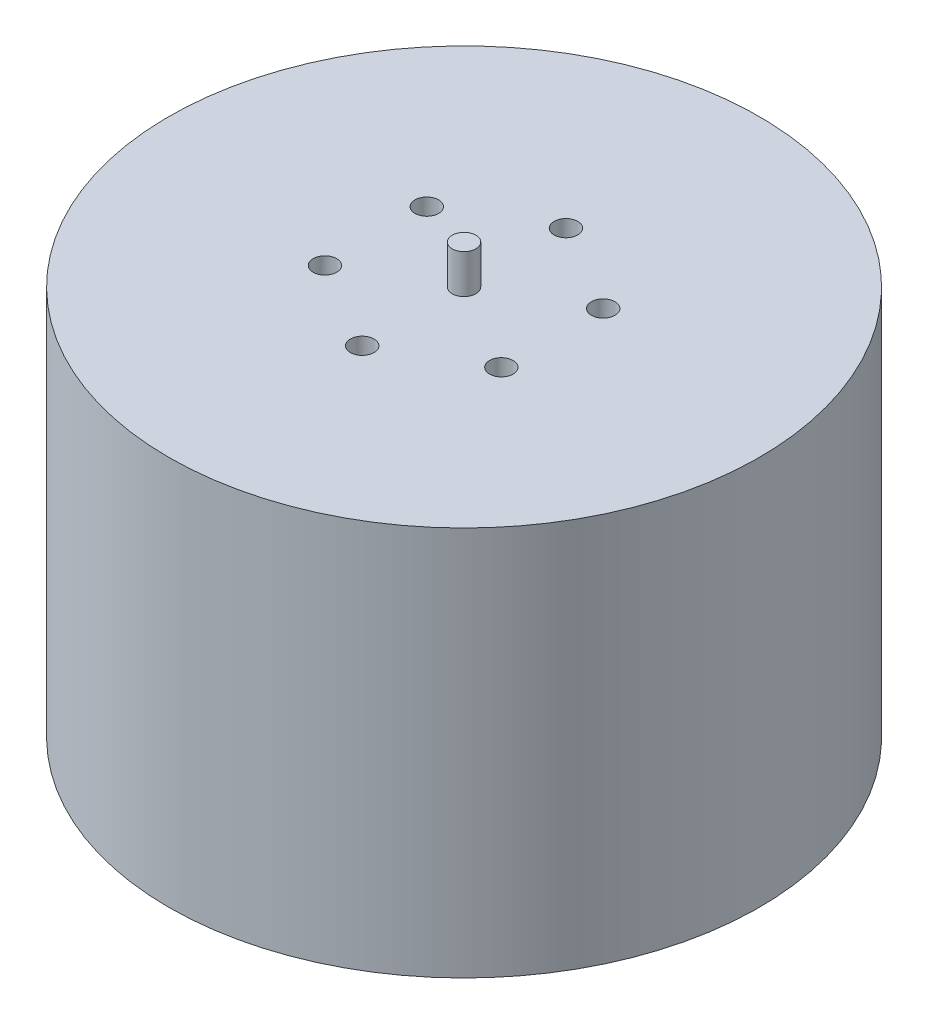
ISO-10303-21;
HEADER;
FILE_DESCRIPTION(('STEP AP214'),'2;1');
FILE_NAME('part.step','',(''),(''),'','','');
FILE_SCHEMA(('AUTOMOTIVE_DESIGN { 1 0 10303 214 1 1 1 1 }'));
ENDSEC;
DATA;
#1=APPLICATION_CONTEXT('core data for automotive mechanical design processes');
#2=APPLICATION_PROTOCOL_DEFINITION('international standard','automotive_design',2000,#1);
#3=PRODUCT_CONTEXT('',#1,'mechanical');
#4=PRODUCT('Part','Part','',(#3));
#5=PRODUCT_RELATED_PRODUCT_CATEGORY('part','',(#4));
#6=PRODUCT_DEFINITION_FORMATION('','',#4);
#7=PRODUCT_DEFINITION_CONTEXT('part definition',#1,'design');
#8=PRODUCT_DEFINITION('design','',#6,#7);
#9=PRODUCT_DEFINITION_SHAPE('','',#8);
#10=(LENGTH_UNIT() NAMED_UNIT(*) SI_UNIT(.MILLI.,.METRE.));
#11=(NAMED_UNIT(*) PLANE_ANGLE_UNIT() SI_UNIT($,.RADIAN.));
#12=(NAMED_UNIT(*) SI_UNIT($,.STERADIAN.) SOLID_ANGLE_UNIT());
#13=UNCERTAINTY_MEASURE_WITH_UNIT(LENGTH_MEASURE(1.E-05),#10,'distance_accuracy_value','');
#14=(GEOMETRIC_REPRESENTATION_CONTEXT(3) GLOBAL_UNCERTAINTY_ASSIGNED_CONTEXT((#13)) GLOBAL_UNIT_ASSIGNED_CONTEXT((#10,
#11,#12)) REPRESENTATION_CONTEXT('',''));
#15=CARTESIAN_POINT('',(0.,0.,0.));
#16=DIRECTION('',(0.,0.,1.));
#17=DIRECTION('',(1.,0.,0.));
#18=AXIS2_PLACEMENT_3D('',#15,#16,#17);
#19=CARTESIAN_POINT('',(0.,66.,0.));
#20=DIRECTION('',(0.,-1.,0.));
#21=DIRECTION('',(0.,0.,-1.));
#22=AXIS2_PLACEMENT_3D('',#19,#20,#21);
#23=CYLINDRICAL_SURFACE('',#22,50.);
#24=CARTESIAN_POINT('',(0.,66.,0.));
#25=DIRECTION('',(0.,1.,0.));
#26=DIRECTION('',(0.,0.,1.));
#27=AXIS2_PLACEMENT_3D('',#24,#25,#26);
#28=CIRCLE('',#27,50.);
#29=CARTESIAN_POINT('',(0.,66.,50.));
#30=VERTEX_POINT('',#29);
#31=EDGE_CURVE('E10',#30,#30,#28,.T.);
#32=ORIENTED_EDGE('',*,*,#31,.F.);
#33=EDGE_LOOP('',(#32));
#34=FACE_BOUND('',#33,.T.);
#35=CARTESIAN_POINT('',(0.,0.,0.));
#36=DIRECTION('',(0.,1.,0.));
#37=DIRECTION('',(0.,0.,1.));
#38=AXIS2_PLACEMENT_3D('',#35,#36,#37);
#39=CIRCLE('',#38,50.);
#40=CARTESIAN_POINT('',(0.,0.,50.));
#41=VERTEX_POINT('',#40);
#42=EDGE_CURVE('E38',#41,#41,#39,.T.);
#43=ORIENTED_EDGE('',*,*,#42,.T.);
#44=EDGE_LOOP('',(#43));
#45=FACE_BOUND('',#44,.T.);
#46=ADVANCED_FACE('F35',(#34,#45),#23,.T.);
#47=CARTESIAN_POINT('',(0.,66.,0.));
#48=DIRECTION('',(0.,1.,0.));
#49=DIRECTION('',(0.,0.,1.));
#50=AXIS2_PLACEMENT_3D('',#47,#48,#49);
#51=PLANE('',#50);
#52=CARTESIAN_POINT('',(0.,66.,0.));
#53=DIRECTION('',(0.,1.,0.));
#54=DIRECTION('',(0.,0.,1.));
#55=AXIS2_PLACEMENT_3D('',#52,#53,#54);
#56=CIRCLE('',#55,2.);
#57=CARTESIAN_POINT('',(0.,66.,2.));
#58=VERTEX_POINT('',#57);
#59=EDGE_CURVE('E83',#58,#58,#56,.T.);
#60=ORIENTED_EDGE('',*,*,#59,.F.);
#61=EDGE_LOOP('',(#60));
#62=FACE_BOUND('',#61,.T.);
#63=CARTESIAN_POINT('',(0.,66.,-17.25));
#64=DIRECTION('',(0.,1.,0.));
#65=DIRECTION('',(0.,0.,1.));
#66=AXIS2_PLACEMENT_3D('',#63,#64,#65);
#67=CIRCLE('',#66,2.);
#68=CARTESIAN_POINT('',(0.,66.,-15.25));
#69=VERTEX_POINT('',#68);
#70=EDGE_CURVE('E68',#69,#69,#67,.T.);
#71=ORIENTED_EDGE('',*,*,#70,.F.);
#72=EDGE_LOOP('',(#71));
#73=FACE_BOUND('',#72,.T.);
#74=CARTESIAN_POINT('',(-14.9389382152816,66.,8.62499999999986));
#75=DIRECTION('',(0.,1.,0.));
#76=DIRECTION('',(0.,0.,1.));
#77=AXIS2_PLACEMENT_3D('',#74,#75,#76);
#78=CIRCLE('',#77,2.);
#79=CARTESIAN_POINT('',(-14.9389382152816,66.,10.6249999999999));
#80=VERTEX_POINT('',#79);
#81=EDGE_CURVE('E57',#80,#80,#78,.T.);
#82=ORIENTED_EDGE('',*,*,#81,.F.);
#83=EDGE_LOOP('',(#82));
#84=FACE_BOUND('',#83,.T.);
#85=CARTESIAN_POINT('',(-1.20456106190088E-13,66.,17.25));
#86=DIRECTION('',(0.,1.,0.));
#87=DIRECTION('',(0.,0.,1.));
#88=AXIS2_PLACEMENT_3D('',#85,#86,#87);
#89=CIRCLE('',#88,2.);
#90=CARTESIAN_POINT('',(-1.20456106190088E-13,66.,19.25));
#91=VERTEX_POINT('',#90);
#92=EDGE_CURVE('E56',#91,#91,#89,.T.);
#93=ORIENTED_EDGE('',*,*,#92,.F.);
#94=EDGE_LOOP('',(#93));
#95=FACE_BOUND('',#94,.T.);
#96=CARTESIAN_POINT('',(14.9389382152815,66.,8.62500000000007));
#97=DIRECTION('',(0.,1.,0.));
#98=DIRECTION('',(0.,0.,1.));
#99=AXIS2_PLACEMENT_3D('',#96,#97,#98);
#100=CIRCLE('',#99,2.);
#101=CARTESIAN_POINT('',(14.9389382152815,66.,10.6250000000001));
#102=VERTEX_POINT('',#101);
#103=EDGE_CURVE('E50',#102,#102,#100,.T.);
#104=ORIENTED_EDGE('',*,*,#103,.F.);
#105=EDGE_LOOP('',(#104));
#106=FACE_BOUND('',#105,.T.);
#107=CARTESIAN_POINT('',(-14.9389382152815,66.,-8.62500000000018));
#108=DIRECTION('',(0.,1.,0.));
#109=DIRECTION('',(0.,0.,1.));
#110=AXIS2_PLACEMENT_3D('',#107,#108,#109);
#111=CIRCLE('',#110,2.);
#112=CARTESIAN_POINT('',(-14.9389382152815,66.,-6.62500000000017));
#113=VERTEX_POINT('',#112);
#114=EDGE_CURVE('E69',#113,#113,#111,.T.);
#115=ORIENTED_EDGE('',*,*,#114,.F.);
#116=EDGE_LOOP('',(#115));
#117=FACE_BOUND('',#116,.T.);
#118=CARTESIAN_POINT('',(14.9389382152816,66.,-8.62499999999997));
#119=DIRECTION('',(0.,1.,0.));
#120=DIRECTION('',(0.,0.,1.));
#121=AXIS2_PLACEMENT_3D('',#118,#119,#120);
#122=CIRCLE('',#121,2.);
#123=CARTESIAN_POINT('',(14.9389382152816,66.,-6.62499999999996));
#124=VERTEX_POINT('',#123);
#125=EDGE_CURVE('E47',#124,#124,#122,.T.);
#126=ORIENTED_EDGE('',*,*,#125,.F.);
#127=EDGE_LOOP('',(#126));
#128=FACE_BOUND('',#127,.T.);
#129=ORIENTED_EDGE('',*,*,#31,.T.);
#130=EDGE_LOOP('',(#129));
#131=FACE_BOUND('',#130,.T.);
#132=ADVANCED_FACE('F132',(#62,#73,#84,#95,#106,#117,#128,#131),#51,.T.);
#133=CARTESIAN_POINT('',(0.,0.,0.));
#134=DIRECTION('',(0.,1.,0.));
#135=DIRECTION('',(0.,0.,1.));
#136=AXIS2_PLACEMENT_3D('',#133,#134,#135);
#137=PLANE('',#136);
#138=CARTESIAN_POINT('',(0.,0.,-32.2228944585277));
#139=DIRECTION('',(0.,-1.,0.));
#140=DIRECTION('',(0.,0.,-1.));
#141=AXIS2_PLACEMENT_3D('',#138,#139,#140);
#142=CIRCLE('',#141,2.);
#143=CARTESIAN_POINT('',(0.,0.,-34.2228944585277));
#144=VERTEX_POINT('',#143);
#145=EDGE_CURVE('E113',#144,#144,#142,.T.);
#146=ORIENTED_EDGE('',*,*,#145,.F.);
#147=EDGE_LOOP('',(#146));
#148=FACE_BOUND('',#147,.T.);
#149=CARTESIAN_POINT('',(-32.2228944585277,0.,1.12505634685461E-13));
#150=DIRECTION('',(0.,-1.,0.));
#151=DIRECTION('',(0.,0.,-1.));
#152=AXIS2_PLACEMENT_3D('',#149,#150,#151);
#153=CIRCLE('',#152,2.);
#154=CARTESIAN_POINT('',(-32.2228944585277,0.,-1.99999999999989));
#155=VERTEX_POINT('',#154);
#156=EDGE_CURVE('E110',#155,#155,#153,.T.);
#157=ORIENTED_EDGE('',*,*,#156,.F.);
#158=EDGE_LOOP('',(#157));
#159=FACE_BOUND('',#158,.T.);
#160=CARTESIAN_POINT('',(2.25011269370922E-13,0.,32.2228944585277));
#161=DIRECTION('',(0.,-1.,0.));
#162=DIRECTION('',(0.,0.,-1.));
#163=AXIS2_PLACEMENT_3D('',#160,#161,#162);
#164=CIRCLE('',#163,2.);
#165=CARTESIAN_POINT('',(2.25011269370922E-13,0.,30.2228944585277));
#166=VERTEX_POINT('',#165);
#167=EDGE_CURVE('E104',#166,#166,#164,.T.);
#168=ORIENTED_EDGE('',*,*,#167,.F.);
#169=EDGE_LOOP('',(#168));
#170=FACE_BOUND('',#169,.T.);
#171=CARTESIAN_POINT('',(32.2228944585277,0.,-3.37516904056383E-13));
#172=DIRECTION('',(0.,-1.,0.));
#173=DIRECTION('',(0.,0.,-1.));
#174=AXIS2_PLACEMENT_3D('',#171,#172,#173);
#175=CIRCLE('',#174,2.);
#176=CARTESIAN_POINT('',(32.2228944585277,0.,-2.00000000000034));
#177=VERTEX_POINT('',#176);
#178=EDGE_CURVE('E98',#177,#177,#175,.T.);
#179=ORIENTED_EDGE('',*,*,#178,.F.);
#180=EDGE_LOOP('',(#179));
#181=FACE_BOUND('',#180,.T.);
#182=CARTESIAN_POINT('',(0.,0.,0.));
#183=DIRECTION('',(0.,-1.,0.));
#184=DIRECTION('',(0.,0.,-1.));
#185=AXIS2_PLACEMENT_3D('',#182,#183,#184);
#186=CIRCLE('',#185,3.);
#187=CARTESIAN_POINT('',(0.,0.,-3.));
#188=VERTEX_POINT('',#187);
#189=EDGE_CURVE('E89',#188,#188,#186,.T.);
#190=ORIENTED_EDGE('',*,*,#189,.F.);
#191=EDGE_LOOP('',(#190));
#192=FACE_BOUND('',#191,.T.);
#193=CARTESIAN_POINT('',(0.,0.,-17.25));
#194=DIRECTION('',(0.,1.,0.));
#195=DIRECTION('',(0.,0.,1.));
#196=AXIS2_PLACEMENT_3D('',#193,#194,#195);
#197=CIRCLE('',#196,2.);
#198=CARTESIAN_POINT('',(0.,0.,-15.25));
#199=VERTEX_POINT('',#198);
#200=EDGE_CURVE('E65',#199,#199,#197,.T.);
#201=ORIENTED_EDGE('',*,*,#200,.T.);
#202=EDGE_LOOP('',(#201));
#203=FACE_BOUND('',#202,.T.);
#204=CARTESIAN_POINT('',(-14.9389382152816,0.,8.62499999999986));
#205=DIRECTION('',(0.,1.,0.));
#206=DIRECTION('',(0.,0.,1.));
#207=AXIS2_PLACEMENT_3D('',#204,#205,#206);
#208=CIRCLE('',#207,2.);
#209=CARTESIAN_POINT('',(-14.9389382152816,0.,10.6249999999999));
#210=VERTEX_POINT('',#209);
#211=EDGE_CURVE('E72',#210,#210,#208,.T.);
#212=ORIENTED_EDGE('',*,*,#211,.T.);
#213=EDGE_LOOP('',(#212));
#214=FACE_BOUND('',#213,.T.);
#215=CARTESIAN_POINT('',(-1.20456106190088E-13,0.,17.25));
#216=DIRECTION('',(0.,1.,0.));
#217=DIRECTION('',(0.,0.,1.));
#218=AXIS2_PLACEMENT_3D('',#215,#216,#217);
#219=CIRCLE('',#218,2.);
#220=CARTESIAN_POINT('',(-1.20456106190088E-13,0.,19.25));
#221=VERTEX_POINT('',#220);
#222=EDGE_CURVE('E53',#221,#221,#219,.T.);
#223=ORIENTED_EDGE('',*,*,#222,.T.);
#224=EDGE_LOOP('',(#223));
#225=FACE_BOUND('',#224,.T.);
#226=CARTESIAN_POINT('',(14.9389382152815,0.,8.62500000000007));
#227=DIRECTION('',(0.,1.,0.));
#228=DIRECTION('',(0.,0.,1.));
#229=AXIS2_PLACEMENT_3D('',#226,#227,#228);
#230=CIRCLE('',#229,2.);
#231=CARTESIAN_POINT('',(14.9389382152815,0.,10.6250000000001));
#232=VERTEX_POINT('',#231);
#233=EDGE_CURVE('E60',#232,#232,#230,.T.);
#234=ORIENTED_EDGE('',*,*,#233,.T.);
#235=EDGE_LOOP('',(#234));
#236=FACE_BOUND('',#235,.T.);
#237=CARTESIAN_POINT('',(-14.9389382152815,0.,-8.62500000000018));
#238=DIRECTION('',(0.,1.,0.));
#239=DIRECTION('',(0.,0.,1.));
#240=AXIS2_PLACEMENT_3D('',#237,#238,#239);
#241=CIRCLE('',#240,2.);
#242=CARTESIAN_POINT('',(-14.9389382152815,0.,-6.62500000000017));
#243=VERTEX_POINT('',#242);
#244=EDGE_CURVE('E77',#243,#243,#241,.T.);
#245=ORIENTED_EDGE('',*,*,#244,.T.);
#246=EDGE_LOOP('',(#245));
#247=FACE_BOUND('',#246,.T.);
#248=CARTESIAN_POINT('',(14.9389382152816,0.,-8.62499999999997));
#249=DIRECTION('',(0.,1.,0.));
#250=DIRECTION('',(0.,0.,1.));
#251=AXIS2_PLACEMENT_3D('',#248,#249,#250);
#252=CIRCLE('',#251,2.);
#253=CARTESIAN_POINT('',(14.9389382152816,0.,-6.62499999999996));
#254=VERTEX_POINT('',#253);
#255=EDGE_CURVE('E45',#254,#254,#252,.T.);
#256=ORIENTED_EDGE('',*,*,#255,.T.);
#257=EDGE_LOOP('',(#256));
#258=FACE_BOUND('',#257,.T.);
#259=ORIENTED_EDGE('',*,*,#42,.F.);
#260=EDGE_LOOP('',(#259));
#261=FACE_BOUND('',#260,.T.);
#262=ADVANCED_FACE('F128',(#148,#159,#170,#181,#192,#203,#214,#225,#236,#247,#258,#261),#137,.F.);
#263=CARTESIAN_POINT('',(14.9389382152816,0.,-8.62499999999997));
#264=DIRECTION('',(0.,1.,0.));
#265=DIRECTION('',(0.,0.,1.));
#266=AXIS2_PLACEMENT_3D('',#263,#264,#265);
#267=CYLINDRICAL_SURFACE('',#266,2.);
#268=ORIENTED_EDGE('',*,*,#255,.F.);
#269=EDGE_LOOP('',(#268));
#270=FACE_BOUND('',#269,.T.);
#271=ORIENTED_EDGE('',*,*,#125,.T.);
#272=EDGE_LOOP('',(#271));
#273=FACE_BOUND('',#272,.T.);
#274=ADVANCED_FACE('F131',(#270,#273),#267,.F.);
#275=CARTESIAN_POINT('',(-14.9389382152815,0.,-8.62500000000018));
#276=DIRECTION('',(0.,1.,0.));
#277=DIRECTION('',(0.,0.,1.));
#278=AXIS2_PLACEMENT_3D('',#275,#276,#277);
#279=CYLINDRICAL_SURFACE('',#278,2.);
#280=ORIENTED_EDGE('',*,*,#244,.F.);
#281=EDGE_LOOP('',(#280));
#282=FACE_BOUND('',#281,.T.);
#283=ORIENTED_EDGE('',*,*,#114,.T.);
#284=EDGE_LOOP('',(#283));
#285=FACE_BOUND('',#284,.T.);
#286=ADVANCED_FACE('F169',(#282,#285),#279,.F.);
#287=CARTESIAN_POINT('',(14.9389382152815,0.,8.62500000000007));
#288=DIRECTION('',(0.,1.,0.));
#289=DIRECTION('',(0.,0.,1.));
#290=AXIS2_PLACEMENT_3D('',#287,#288,#289);
#291=CYLINDRICAL_SURFACE('',#290,2.);
#292=ORIENTED_EDGE('',*,*,#233,.F.);
#293=EDGE_LOOP('',(#292));
#294=FACE_BOUND('',#293,.T.);
#295=ORIENTED_EDGE('',*,*,#103,.T.);
#296=EDGE_LOOP('',(#295));
#297=FACE_BOUND('',#296,.T.);
#298=ADVANCED_FACE('F175',(#294,#297),#291,.F.);
#299=CARTESIAN_POINT('',(-1.20456106190088E-13,0.,17.25));
#300=DIRECTION('',(0.,1.,0.));
#301=DIRECTION('',(0.,0.,1.));
#302=AXIS2_PLACEMENT_3D('',#299,#300,#301);
#303=CYLINDRICAL_SURFACE('',#302,2.);
#304=ORIENTED_EDGE('',*,*,#222,.F.);
#305=EDGE_LOOP('',(#304));
#306=FACE_BOUND('',#305,.T.);
#307=ORIENTED_EDGE('',*,*,#92,.T.);
#308=EDGE_LOOP('',(#307));
#309=FACE_BOUND('',#308,.T.);
#310=ADVANCED_FACE('F171',(#306,#309),#303,.F.);
#311=CARTESIAN_POINT('',(-14.9389382152816,0.,8.62499999999986));
#312=DIRECTION('',(0.,1.,0.));
#313=DIRECTION('',(0.,0.,1.));
#314=AXIS2_PLACEMENT_3D('',#311,#312,#313);
#315=CYLINDRICAL_SURFACE('',#314,2.);
#316=ORIENTED_EDGE('',*,*,#211,.F.);
#317=EDGE_LOOP('',(#316));
#318=FACE_BOUND('',#317,.T.);
#319=ORIENTED_EDGE('',*,*,#81,.T.);
#320=EDGE_LOOP('',(#319));
#321=FACE_BOUND('',#320,.T.);
#322=ADVANCED_FACE('F174',(#318,#321),#315,.F.);
#323=CARTESIAN_POINT('',(0.,0.,-17.25));
#324=DIRECTION('',(0.,1.,0.));
#325=DIRECTION('',(0.,0.,1.));
#326=AXIS2_PLACEMENT_3D('',#323,#324,#325);
#327=CYLINDRICAL_SURFACE('',#326,2.);
#328=ORIENTED_EDGE('',*,*,#200,.F.);
#329=EDGE_LOOP('',(#328));
#330=FACE_BOUND('',#329,.T.);
#331=ORIENTED_EDGE('',*,*,#70,.T.);
#332=EDGE_LOOP('',(#331));
#333=FACE_BOUND('',#332,.T.);
#334=ADVANCED_FACE('F180',(#330,#333),#327,.F.);
#335=CARTESIAN_POINT('',(0.,72.6,0.));
#336=DIRECTION('',(0.,-1.,0.));
#337=DIRECTION('',(0.,0.,-1.));
#338=AXIS2_PLACEMENT_3D('',#335,#336,#337);
#339=CYLINDRICAL_SURFACE('',#338,2.);
#340=CARTESIAN_POINT('',(0.,72.6,0.));
#341=DIRECTION('',(0.,1.,0.));
#342=DIRECTION('',(0.,0.,1.));
#343=AXIS2_PLACEMENT_3D('',#340,#341,#342);
#344=CIRCLE('',#343,2.);
#345=CARTESIAN_POINT('',(0.,72.6,2.));
#346=VERTEX_POINT('',#345);
#347=EDGE_CURVE('E80',#346,#346,#344,.T.);
#348=ORIENTED_EDGE('',*,*,#347,.F.);
#349=EDGE_LOOP('',(#348));
#350=FACE_BOUND('',#349,.T.);
#351=ORIENTED_EDGE('',*,*,#59,.T.);
#352=EDGE_LOOP('',(#351));
#353=FACE_BOUND('',#352,.T.);
#354=ADVANCED_FACE('F183',(#350,#353),#339,.T.);
#355=CARTESIAN_POINT('',(0.,72.6,0.));
#356=DIRECTION('',(0.,1.,0.));
#357=DIRECTION('',(0.,0.,1.));
#358=AXIS2_PLACEMENT_3D('',#355,#356,#357);
#359=PLANE('',#358);
#360=ORIENTED_EDGE('',*,*,#347,.T.);
#361=EDGE_LOOP('',(#360));
#362=FACE_BOUND('',#361,.T.);
#363=ADVANCED_FACE('F193',(#362),#359,.T.);
#364=CARTESIAN_POINT('',(0.,6.,0.));
#365=DIRECTION('',(0.,-1.,0.));
#366=DIRECTION('',(0.,0.,-1.));
#367=AXIS2_PLACEMENT_3D('',#364,#365,#366);
#368=CYLINDRICAL_SURFACE('',#367,3.);
#369=CARTESIAN_POINT('',(0.,6.,0.));
#370=DIRECTION('',(0.,-1.,0.));
#371=DIRECTION('',(0.,0.,-1.));
#372=AXIS2_PLACEMENT_3D('',#369,#370,#371);
#373=CIRCLE('',#372,3.);
#374=CARTESIAN_POINT('',(0.,6.,-3.));
#375=VERTEX_POINT('',#374);
#376=EDGE_CURVE('E86',#375,#375,#373,.T.);
#377=ORIENTED_EDGE('',*,*,#376,.F.);
#378=EDGE_LOOP('',(#377));
#379=FACE_BOUND('',#378,.T.);
#380=ORIENTED_EDGE('',*,*,#189,.T.);
#381=EDGE_LOOP('',(#380));
#382=FACE_BOUND('',#381,.T.);
#383=ADVANCED_FACE('F197',(#379,#382),#368,.F.);
#384=CARTESIAN_POINT('',(0.,6.,0.));
#385=DIRECTION('',(0.,-1.,0.));
#386=DIRECTION('',(0.,0.,-1.));
#387=AXIS2_PLACEMENT_3D('',#384,#385,#386);
#388=PLANE('',#387);
#389=ORIENTED_EDGE('',*,*,#376,.T.);
#390=EDGE_LOOP('',(#389));
#391=FACE_BOUND('',#390,.T.);
#392=ADVANCED_FACE('F201',(#391),#388,.T.);
#393=CARTESIAN_POINT('',(32.2228944585277,6.,-3.37516904056383E-13));
#394=DIRECTION('',(0.,-1.,0.));
#395=DIRECTION('',(0.,0.,-1.));
#396=AXIS2_PLACEMENT_3D('',#393,#394,#395);
#397=CYLINDRICAL_SURFACE('',#396,2.);
#398=CARTESIAN_POINT('',(32.2228944585277,6.,-3.37516904056383E-13));
#399=DIRECTION('',(0.,-1.,0.));
#400=DIRECTION('',(0.,0.,-1.));
#401=AXIS2_PLACEMENT_3D('',#398,#399,#400);
#402=CIRCLE('',#401,2.);
#403=CARTESIAN_POINT('',(32.2228944585277,6.,-2.00000000000034));
#404=VERTEX_POINT('',#403);
#405=EDGE_CURVE('E95',#404,#404,#402,.T.);
#406=ORIENTED_EDGE('',*,*,#405,.F.);
#407=EDGE_LOOP('',(#406));
#408=FACE_BOUND('',#407,.T.);
#409=ORIENTED_EDGE('',*,*,#178,.T.);
#410=EDGE_LOOP('',(#409));
#411=FACE_BOUND('',#410,.T.);
#412=ADVANCED_FACE('F205',(#408,#411),#397,.F.);
#413=CARTESIAN_POINT('',(32.2228944585277,6.,-3.37516904056383E-13));
#414=DIRECTION('',(0.,-1.,0.));
#415=DIRECTION('',(0.,0.,-1.));
#416=AXIS2_PLACEMENT_3D('',#413,#414,#415);
#417=PLANE('',#416);
#418=ORIENTED_EDGE('',*,*,#405,.T.);
#419=EDGE_LOOP('',(#418));
#420=FACE_BOUND('',#419,.T.);
#421=ADVANCED_FACE('F207',(#420),#417,.T.);
#422=CARTESIAN_POINT('',(2.25011269370922E-13,6.,32.2228944585277));
#423=DIRECTION('',(0.,-1.,0.));
#424=DIRECTION('',(0.,0.,-1.));
#425=AXIS2_PLACEMENT_3D('',#422,#423,#424);
#426=CYLINDRICAL_SURFACE('',#425,2.);
#427=CARTESIAN_POINT('',(2.25011269370922E-13,6.,32.2228944585277));
#428=DIRECTION('',(0.,-1.,0.));
#429=DIRECTION('',(0.,0.,-1.));
#430=AXIS2_PLACEMENT_3D('',#427,#428,#429);
#431=CIRCLE('',#430,2.);
#432=CARTESIAN_POINT('',(2.25011269370922E-13,6.,30.2228944585277));
#433=VERTEX_POINT('',#432);
#434=EDGE_CURVE('E101',#433,#433,#431,.T.);
#435=ORIENTED_EDGE('',*,*,#434,.F.);
#436=EDGE_LOOP('',(#435));
#437=FACE_BOUND('',#436,.T.);
#438=ORIENTED_EDGE('',*,*,#167,.T.);
#439=EDGE_LOOP('',(#438));
#440=FACE_BOUND('',#439,.T.);
#441=ADVANCED_FACE('F210',(#437,#440),#426,.F.);
#442=CARTESIAN_POINT('',(2.25011269370922E-13,6.,32.2228944585277));
#443=DIRECTION('',(0.,-1.,0.));
#444=DIRECTION('',(0.,0.,-1.));
#445=AXIS2_PLACEMENT_3D('',#442,#443,#444);
#446=PLANE('',#445);
#447=ORIENTED_EDGE('',*,*,#434,.T.);
#448=EDGE_LOOP('',(#447));
#449=FACE_BOUND('',#448,.T.);
#450=ADVANCED_FACE('F215',(#449),#446,.T.);
#451=CARTESIAN_POINT('',(-32.2228944585277,6.,1.12505634685461E-13));
#452=DIRECTION('',(0.,-1.,0.));
#453=DIRECTION('',(0.,0.,-1.));
#454=AXIS2_PLACEMENT_3D('',#451,#452,#453);
#455=CYLINDRICAL_SURFACE('',#454,2.);
#456=CARTESIAN_POINT('',(-32.2228944585277,6.,1.12505634685461E-13));
#457=DIRECTION('',(0.,-1.,0.));
#458=DIRECTION('',(0.,0.,-1.));
#459=AXIS2_PLACEMENT_3D('',#456,#457,#458);
#460=CIRCLE('',#459,2.);
#461=CARTESIAN_POINT('',(-32.2228944585277,6.,-1.99999999999989));
#462=VERTEX_POINT('',#461);
#463=EDGE_CURVE('E107',#462,#462,#460,.T.);
#464=ORIENTED_EDGE('',*,*,#463,.F.);
#465=EDGE_LOOP('',(#464));
#466=FACE_BOUND('',#465,.T.);
#467=ORIENTED_EDGE('',*,*,#156,.T.);
#468=EDGE_LOOP('',(#467));
#469=FACE_BOUND('',#468,.T.);
#470=ADVANCED_FACE('F218',(#466,#469),#455,.F.);
#471=CARTESIAN_POINT('',(-32.2228944585277,6.,1.12505634685461E-13));
#472=DIRECTION('',(0.,-1.,0.));
#473=DIRECTION('',(0.,0.,-1.));
#474=AXIS2_PLACEMENT_3D('',#471,#472,#473);
#475=PLANE('',#474);
#476=ORIENTED_EDGE('',*,*,#463,.T.);
#477=EDGE_LOOP('',(#476));
#478=FACE_BOUND('',#477,.T.);
#479=ADVANCED_FACE('F124',(#478),#475,.T.);
#480=CARTESIAN_POINT('',(0.,6.,-32.2228944585277));
#481=DIRECTION('',(0.,-1.,0.));
#482=DIRECTION('',(0.,0.,-1.));
#483=AXIS2_PLACEMENT_3D('',#480,#481,#482);
#484=CYLINDRICAL_SURFACE('',#483,2.);
#485=CARTESIAN_POINT('',(0.,6.,-32.2228944585277));
#486=DIRECTION('',(0.,-1.,0.));
#487=DIRECTION('',(0.,0.,-1.));
#488=AXIS2_PLACEMENT_3D('',#485,#486,#487);
#489=CIRCLE('',#488,2.);
#490=CARTESIAN_POINT('',(0.,6.,-34.2228944585277));
#491=VERTEX_POINT('',#490);
#492=EDGE_CURVE('E92',#491,#491,#489,.T.);
#493=ORIENTED_EDGE('',*,*,#492,.F.);
#494=EDGE_LOOP('',(#493));
#495=FACE_BOUND('',#494,.T.);
#496=ORIENTED_EDGE('',*,*,#145,.T.);
#497=EDGE_LOOP('',(#496));
#498=FACE_BOUND('',#497,.T.);
#499=ADVANCED_FACE('F121',(#495,#498),#484,.F.);
#500=CARTESIAN_POINT('',(0.,6.,-32.2228944585277));
#501=DIRECTION('',(0.,-1.,0.));
#502=DIRECTION('',(0.,0.,-1.));
#503=AXIS2_PLACEMENT_3D('',#500,#501,#502);
#504=PLANE('',#503);
#505=ORIENTED_EDGE('',*,*,#492,.T.);
#506=EDGE_LOOP('',(#505));
#507=FACE_BOUND('',#506,.T.);
#508=ADVANCED_FACE('F119',(#507),#504,.T.);
#509=CLOSED_SHELL('',(#46,#132,#262,#274,#286,#298,#310,#322,#334,#354,#363,#383,#392,#412,#421,
#441,#450,#470,#479,#499,#508));
#510=MANIFOLD_SOLID_BREP('B2',#509);
#511=ADVANCED_BREP_SHAPE_REPRESENTATION('',(#18,#510),#14);
#512=SHAPE_DEFINITION_REPRESENTATION(#9,#511);
ENDSEC;
END-ISO-10303-21;
